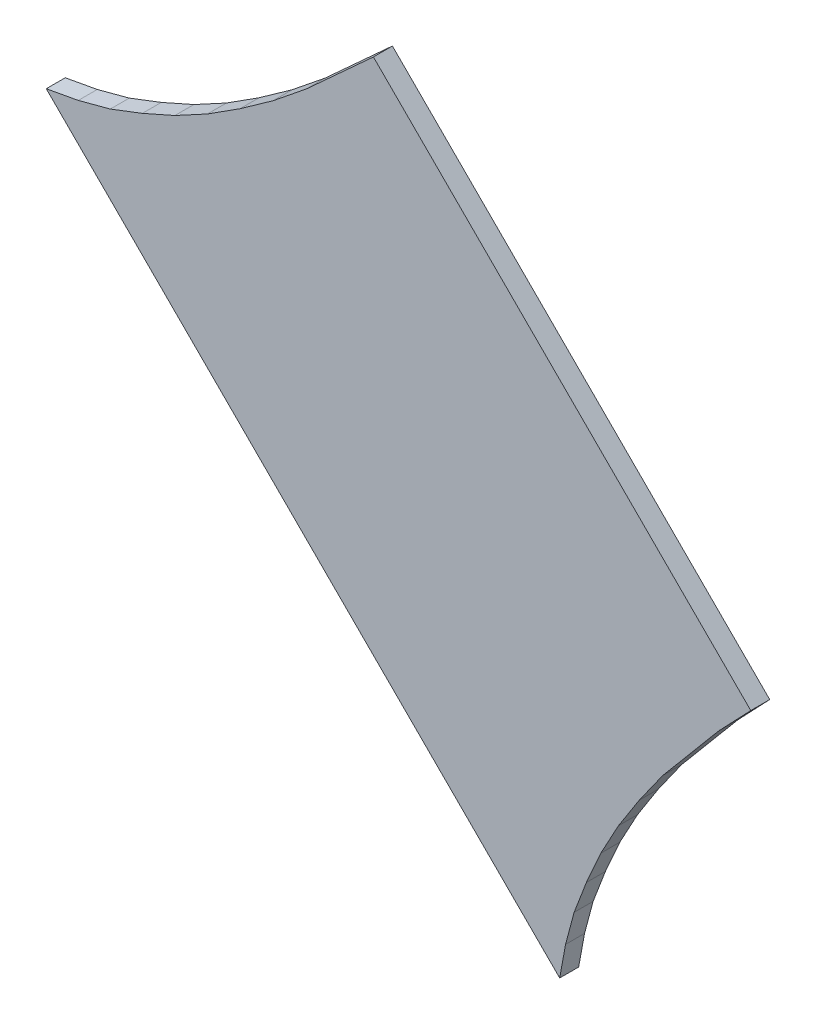
ISO-10303-21;
HEADER;
FILE_DESCRIPTION(('STEP AP214'),'2;1');
FILE_NAME('part.step','',(''),(''),'','','');
FILE_SCHEMA(('AUTOMOTIVE_DESIGN { 1 0 10303 214 1 1 1 1 }'));
ENDSEC;
DATA;
#1=APPLICATION_CONTEXT('core data for automotive mechanical design processes');
#2=APPLICATION_PROTOCOL_DEFINITION('international standard','automotive_design',2000,#1);
#3=PRODUCT_CONTEXT('',#1,'mechanical');
#4=PRODUCT('Part','Part','',(#3));
#5=PRODUCT_RELATED_PRODUCT_CATEGORY('part','',(#4));
#6=PRODUCT_DEFINITION_FORMATION('','',#4);
#7=PRODUCT_DEFINITION_CONTEXT('part definition',#1,'design');
#8=PRODUCT_DEFINITION('design','',#6,#7);
#9=PRODUCT_DEFINITION_SHAPE('','',#8);
#10=(LENGTH_UNIT() NAMED_UNIT(*) SI_UNIT(.MILLI.,.METRE.));
#11=(NAMED_UNIT(*) PLANE_ANGLE_UNIT() SI_UNIT($,.RADIAN.));
#12=(NAMED_UNIT(*) SI_UNIT($,.STERADIAN.) SOLID_ANGLE_UNIT());
#13=UNCERTAINTY_MEASURE_WITH_UNIT(LENGTH_MEASURE(1.E-05),#10,'distance_accuracy_value','');
#14=(GEOMETRIC_REPRESENTATION_CONTEXT(3) GLOBAL_UNCERTAINTY_ASSIGNED_CONTEXT((#13)) GLOBAL_UNIT_ASSIGNED_CONTEXT((#10,
#11,#12)) REPRESENTATION_CONTEXT('',''));
#15=CARTESIAN_POINT('',(0.,0.,0.));
#16=DIRECTION('',(0.,0.,1.));
#17=DIRECTION('',(1.,0.,0.));
#18=AXIS2_PLACEMENT_3D('',#15,#16,#17);
#19=CARTESIAN_POINT('',(117.693000793457,53.6599998474121,0.));
#20=DIRECTION('',(0.674137327167643,-0.738606027675963,0.));
#21=DIRECTION('',(-0.738606027675963,-0.674137327167643,0.));
#22=AXIS2_PLACEMENT_3D('',#19,#20,#21);
#23=PLANE('',#22);
#24=DIRECTION('',(-0.738606027675963,-0.674137327167643,0.));
#25=VECTOR('',#24,1.);
#26=CARTESIAN_POINT('',(117.693000793457,53.6599998474121,0.03556));
#27=LINE('',#26,#25);
#28=CARTESIAN_POINT('',(117.693000793457,53.6599998474121,0.03556));
#29=VERTEX_POINT('',#28);
#30=CARTESIAN_POINT('',(117.567001342773,53.5449981689453,0.03556));
#31=VERTEX_POINT('',#30);
#32=EDGE_CURVE('E11',#29,#31,#27,.T.);
#33=ORIENTED_EDGE('',*,*,#32,.F.);
#34=DIRECTION('',(0.,0.,1.));
#35=VECTOR('',#34,1.);
#36=CARTESIAN_POINT('',(117.693000793457,53.6599998474121,0.));
#37=LINE('',#36,#35);
#38=CARTESIAN_POINT('',(117.693000793457,53.6599998474121,0.));
#39=VERTEX_POINT('',#38);
#40=EDGE_CURVE('E24',#39,#29,#37,.T.);
#41=ORIENTED_EDGE('',*,*,#40,.F.);
#42=DIRECTION('',(-0.738606027675963,-0.674137327167643,0.));
#43=VECTOR('',#42,1.);
#44=CARTESIAN_POINT('',(117.693000793457,53.6599998474121,0.));
#45=LINE('',#44,#43);
#46=CARTESIAN_POINT('',(117.567001342773,53.5449981689453,0.));
#47=VERTEX_POINT('',#46);
#48=EDGE_CURVE('E172',#39,#47,#45,.T.);
#49=ORIENTED_EDGE('',*,*,#48,.T.);
#50=DIRECTION('',(0.,0.,1.));
#51=VECTOR('',#50,1.);
#52=CARTESIAN_POINT('',(117.567001342773,53.5449981689453,0.));
#53=LINE('',#52,#51);
#54=EDGE_CURVE('E37',#47,#31,#53,.T.);
#55=ORIENTED_EDGE('',*,*,#54,.T.);
#56=EDGE_LOOP('',(#33,#41,#49,#55));
#57=FACE_BOUND('',#56,.T.);
#58=ADVANCED_FACE('F17',(#57),#23,.F.);
#59=CARTESIAN_POINT('',(117.567001342773,53.5449981689453,0.));
#60=DIRECTION('',(0.627721559394667,-0.778437951201718,0.));
#61=DIRECTION('',(-0.778437951201718,-0.627721559394667,0.));
#62=AXIS2_PLACEMENT_3D('',#59,#60,#61);
#63=PLANE('',#62);
#64=DIRECTION('',(-0.778437951201718,-0.627721559394667,0.));
#65=VECTOR('',#64,1.);
#66=CARTESIAN_POINT('',(117.567001342773,53.5449981689453,0.03556));
#67=LINE('',#66,#65);
#68=CARTESIAN_POINT('',(117.504997253418,53.4949989318848,0.03556));
#69=VERTEX_POINT('',#68);
#70=EDGE_CURVE('E308',#31,#69,#67,.T.);
#71=ORIENTED_EDGE('',*,*,#70,.F.);
#72=ORIENTED_EDGE('',*,*,#54,.F.);
#73=DIRECTION('',(-0.778437951201718,-0.627721559394667,0.));
#74=VECTOR('',#73,1.);
#75=CARTESIAN_POINT('',(117.567001342773,53.5449981689453,0.));
#76=LINE('',#75,#74);
#77=CARTESIAN_POINT('',(117.504997253418,53.4949989318848,0.));
#78=VERTEX_POINT('',#77);
#79=EDGE_CURVE('E305',#47,#78,#76,.T.);
#80=ORIENTED_EDGE('',*,*,#79,.T.);
#81=DIRECTION('',(0.,0.,1.));
#82=VECTOR('',#81,1.);
#83=CARTESIAN_POINT('',(117.504997253418,53.4949989318848,0.));
#84=LINE('',#83,#82);
#85=EDGE_CURVE('E303',#78,#69,#84,.T.);
#86=ORIENTED_EDGE('',*,*,#85,.T.);
#87=EDGE_LOOP('',(#71,#72,#80,#86));
#88=FACE_BOUND('',#87,.T.);
#89=ADVANCED_FACE('F316',(#88),#63,.F.);
#90=CARTESIAN_POINT('',(117.504997253418,53.4949989318848,0.));
#91=DIRECTION('',(0.578757770808919,-0.815499505044786,0.));
#92=DIRECTION('',(-0.815499505044786,-0.578757770808919,0.));
#93=AXIS2_PLACEMENT_3D('',#90,#91,#92);
#94=PLANE('',#93);
#95=DIRECTION('',(-0.815499505044786,-0.578757770808919,0.));
#96=VECTOR('',#95,1.);
#97=CARTESIAN_POINT('',(117.504997253418,53.4949989318848,0.03556));
#98=LINE('',#97,#96);
#99=CARTESIAN_POINT('',(117.443000793457,53.451000213623,0.03556));
#100=VERTEX_POINT('',#99);
#101=EDGE_CURVE('E300',#69,#100,#98,.T.);
#102=ORIENTED_EDGE('',*,*,#101,.F.);
#103=ORIENTED_EDGE('',*,*,#85,.F.);
#104=DIRECTION('',(-0.815499505044786,-0.578757770808919,0.));
#105=VECTOR('',#104,1.);
#106=CARTESIAN_POINT('',(117.504997253418,53.4949989318848,0.));
#107=LINE('',#106,#105);
#108=CARTESIAN_POINT('',(117.443000793457,53.451000213623,0.));
#109=VERTEX_POINT('',#108);
#110=EDGE_CURVE('E297',#78,#109,#107,.T.);
#111=ORIENTED_EDGE('',*,*,#110,.T.);
#112=DIRECTION('',(0.,0.,1.));
#113=VECTOR('',#112,1.);
#114=CARTESIAN_POINT('',(117.443000793457,53.451000213623,0.));
#115=LINE('',#114,#113);
#116=EDGE_CURVE('E295',#109,#100,#115,.T.);
#117=ORIENTED_EDGE('',*,*,#116,.T.);
#118=EDGE_LOOP('',(#102,#103,#111,#117));
#119=FACE_BOUND('',#118,.T.);
#120=ADVANCED_FACE('F322',(#119),#94,.F.);
#121=CARTESIAN_POINT('',(117.443000793457,53.451000213623,0.));
#122=DIRECTION('',(0.538694810440099,-0.842500979942995,0.));
#123=DIRECTION('',(-0.842500979942995,-0.538694810440099,0.));
#124=AXIS2_PLACEMENT_3D('',#121,#122,#123);
#125=PLANE('',#124);
#126=DIRECTION('',(-0.842500979942995,-0.538694810440099,0.));
#127=VECTOR('',#126,1.);
#128=CARTESIAN_POINT('',(117.443000793457,53.451000213623,0.03556));
#129=LINE('',#128,#127);
#130=CARTESIAN_POINT('',(117.38200378418,53.4119987487793,0.03556));
#131=VERTEX_POINT('',#130);
#132=EDGE_CURVE('E292',#100,#131,#129,.T.);
#133=ORIENTED_EDGE('',*,*,#132,.F.);
#134=ORIENTED_EDGE('',*,*,#116,.F.);
#135=DIRECTION('',(-0.842500979942995,-0.538694810440099,0.));
#136=VECTOR('',#135,1.);
#137=CARTESIAN_POINT('',(117.443000793457,53.451000213623,0.));
#138=LINE('',#137,#136);
#139=CARTESIAN_POINT('',(117.38200378418,53.4119987487793,0.));
#140=VERTEX_POINT('',#139);
#141=EDGE_CURVE('E289',#109,#140,#138,.T.);
#142=ORIENTED_EDGE('',*,*,#141,.T.);
#143=DIRECTION('',(0.,0.,1.));
#144=VECTOR('',#143,1.);
#145=CARTESIAN_POINT('',(117.38200378418,53.4119987487793,0.));
#146=LINE('',#145,#144);
#147=EDGE_CURVE('E287',#140,#131,#146,.T.);
#148=ORIENTED_EDGE('',*,*,#147,.T.);
#149=EDGE_LOOP('',(#133,#134,#142,#148));
#150=FACE_BOUND('',#149,.T.);
#151=ADVANCED_FACE('F324',(#150),#125,.F.);
#152=CARTESIAN_POINT('',(117.38200378418,53.4119987487793,0.));
#153=DIRECTION('',(0.475758597963286,-0.879575895795245,0.));
#154=DIRECTION('',(-0.879575895795245,-0.475758597963286,0.));
#155=AXIS2_PLACEMENT_3D('',#152,#153,#154);
#156=PLANE('',#155);
#157=DIRECTION('',(-0.879575895795245,-0.475758597963286,0.));
#158=VECTOR('',#157,1.);
#159=CARTESIAN_POINT('',(117.38200378418,53.4119987487793,0.03556));
#160=LINE('',#159,#158);
#161=CARTESIAN_POINT('',(117.320999145508,53.3790016174316,0.03556));
#162=VERTEX_POINT('',#161);
#163=EDGE_CURVE('E284',#131,#162,#160,.T.);
#164=ORIENTED_EDGE('',*,*,#163,.F.);
#165=ORIENTED_EDGE('',*,*,#147,.F.);
#166=DIRECTION('',(-0.879575895795245,-0.475758597963286,0.));
#167=VECTOR('',#166,1.);
#168=CARTESIAN_POINT('',(117.38200378418,53.4119987487793,0.));
#169=LINE('',#168,#167);
#170=CARTESIAN_POINT('',(117.320999145508,53.3790016174316,0.));
#171=VERTEX_POINT('',#170);
#172=EDGE_CURVE('E281',#140,#171,#169,.T.);
#173=ORIENTED_EDGE('',*,*,#172,.T.);
#174=DIRECTION('',(0.,0.,1.));
#175=VECTOR('',#174,1.);
#176=CARTESIAN_POINT('',(117.320999145508,53.3790016174316,0.));
#177=LINE('',#176,#175);
#178=EDGE_CURVE('E279',#171,#162,#177,.T.);
#179=ORIENTED_EDGE('',*,*,#178,.T.);
#180=EDGE_LOOP('',(#164,#165,#173,#179));
#181=FACE_BOUND('',#180,.T.);
#182=ADVANCED_FACE('F329',(#181),#156,.F.);
#183=CARTESIAN_POINT('',(117.320999145508,53.3790016174316,0.));
#184=DIRECTION('',(0.404769061439909,-0.914418944959615,0.));
#185=DIRECTION('',(-0.914418944959615,-0.404769061439909,0.));
#186=AXIS2_PLACEMENT_3D('',#183,#184,#185);
#187=PLANE('',#186);
#188=DIRECTION('',(-0.914418944959615,-0.404769061439909,0.));
#189=VECTOR('',#188,1.);
#190=CARTESIAN_POINT('',(117.320999145508,53.3790016174316,0.03556));
#191=LINE('',#190,#189);
#192=CARTESIAN_POINT('',(117.26000213623,53.3520011901855,0.03556));
#193=VERTEX_POINT('',#192);
#194=EDGE_CURVE('E276',#162,#193,#191,.T.);
#195=ORIENTED_EDGE('',*,*,#194,.F.);
#196=ORIENTED_EDGE('',*,*,#178,.F.);
#197=DIRECTION('',(-0.914418944959615,-0.404769061439909,0.));
#198=VECTOR('',#197,1.);
#199=CARTESIAN_POINT('',(117.320999145508,53.3790016174316,0.));
#200=LINE('',#199,#198);
#201=CARTESIAN_POINT('',(117.26000213623,53.3520011901855,0.));
#202=VERTEX_POINT('',#201);
#203=EDGE_CURVE('E273',#171,#202,#200,.T.);
#204=ORIENTED_EDGE('',*,*,#203,.T.);
#205=DIRECTION('',(0.,0.,1.));
#206=VECTOR('',#205,1.);
#207=CARTESIAN_POINT('',(117.26000213623,53.3520011901855,0.));
#208=LINE('',#207,#206);
#209=EDGE_CURVE('E271',#202,#193,#208,.T.);
#210=ORIENTED_EDGE('',*,*,#209,.T.);
#211=EDGE_LOOP('',(#195,#196,#204,#210));
#212=FACE_BOUND('',#211,.T.);
#213=ADVANCED_FACE('F332',(#212),#187,.F.);
#214=CARTESIAN_POINT('',(117.26000213623,53.3520011901855,0.));
#215=DIRECTION('',(0.357944637527047,-0.933742810663424,0.));
#216=DIRECTION('',(-0.933742810663424,-0.357944637527047,0.));
#217=AXIS2_PLACEMENT_3D('',#214,#215,#216);
#218=PLANE('',#217);
#219=DIRECTION('',(-0.933742810663424,-0.357944637527047,0.));
#220=VECTOR('',#219,1.);
#221=CARTESIAN_POINT('',(117.26000213623,53.3520011901855,0.03556));
#222=LINE('',#221,#220);
#223=CARTESIAN_POINT('',(117.199996948242,53.3289985656738,0.03556));
#224=VERTEX_POINT('',#223);
#225=EDGE_CURVE('E268',#193,#224,#222,.T.);
#226=ORIENTED_EDGE('',*,*,#225,.F.);
#227=ORIENTED_EDGE('',*,*,#209,.F.);
#228=DIRECTION('',(-0.933742810663424,-0.357944637527047,0.));
#229=VECTOR('',#228,1.);
#230=CARTESIAN_POINT('',(117.26000213623,53.3520011901855,0.));
#231=LINE('',#230,#229);
#232=CARTESIAN_POINT('',(117.199996948242,53.3289985656738,0.));
#233=VERTEX_POINT('',#232);
#234=EDGE_CURVE('E265',#202,#233,#231,.T.);
#235=ORIENTED_EDGE('',*,*,#234,.T.);
#236=DIRECTION('',(0.,0.,1.));
#237=VECTOR('',#236,1.);
#238=CARTESIAN_POINT('',(117.199996948242,53.3289985656738,0.));
#239=LINE('',#238,#237);
#240=EDGE_CURVE('E263',#233,#224,#239,.T.);
#241=ORIENTED_EDGE('',*,*,#240,.T.);
#242=EDGE_LOOP('',(#226,#227,#235,#241));
#243=FACE_BOUND('',#242,.T.);
#244=ADVANCED_FACE('F337',(#243),#218,.F.);
#245=CARTESIAN_POINT('',(117.199996948242,53.3289985656738,0.));
#246=DIRECTION('',(0.257655003142413,-0.966236978880276,0.));
#247=DIRECTION('',(-0.966236978880276,-0.257655003142413,0.));
#248=AXIS2_PLACEMENT_3D('',#245,#246,#247);
#249=PLANE('',#248);
#250=DIRECTION('',(-0.966236978880276,-0.257655003142413,0.));
#251=VECTOR('',#250,1.);
#252=CARTESIAN_POINT('',(117.199996948242,53.3289985656738,0.03556));
#253=LINE('',#252,#251);
#254=CARTESIAN_POINT('',(117.139999389648,53.3129997253418,0.03556));
#255=VERTEX_POINT('',#254);
#256=EDGE_CURVE('E260',#224,#255,#253,.T.);
#257=ORIENTED_EDGE('',*,*,#256,.F.);
#258=ORIENTED_EDGE('',*,*,#240,.F.);
#259=DIRECTION('',(-0.966236978880276,-0.257655003142413,0.));
#260=VECTOR('',#259,1.);
#261=CARTESIAN_POINT('',(117.199996948242,53.3289985656738,0.));
#262=LINE('',#261,#260);
#263=CARTESIAN_POINT('',(117.139999389648,53.3129997253418,0.));
#264=VERTEX_POINT('',#263);
#265=EDGE_CURVE('E257',#233,#264,#262,.T.);
#266=ORIENTED_EDGE('',*,*,#265,.T.);
#267=DIRECTION('',(0.,0.,1.));
#268=VECTOR('',#267,1.);
#269=CARTESIAN_POINT('',(117.139999389648,53.3129997253418,0.));
#270=LINE('',#269,#268);
#271=EDGE_CURVE('E255',#264,#255,#270,.T.);
#272=ORIENTED_EDGE('',*,*,#271,.T.);
#273=EDGE_LOOP('',(#257,#258,#266,#272));
#274=FACE_BOUND('',#273,.T.);
#275=ADVANCED_FACE('F340',(#274),#249,.F.);
#276=CARTESIAN_POINT('',(117.139999389648,53.3129997253418,0.));
#277=DIRECTION('',(0.180360137856034,-0.983600640845944,0.));
#278=DIRECTION('',(-0.983600640845944,-0.180360137856034,0.));
#279=AXIS2_PLACEMENT_3D('',#276,#277,#278);
#280=PLANE('',#279);
#281=DIRECTION('',(-0.983600640845944,-0.180360137856034,0.));
#282=VECTOR('',#281,1.);
#283=CARTESIAN_POINT('',(117.139999389648,53.3129997253418,0.03556));
#284=LINE('',#283,#282);
#285=CARTESIAN_POINT('',(117.080001831055,53.3019981384277,0.03556));
#286=VERTEX_POINT('',#285);
#287=EDGE_CURVE('E252',#255,#286,#284,.T.);
#288=ORIENTED_EDGE('',*,*,#287,.F.);
#289=ORIENTED_EDGE('',*,*,#271,.F.);
#290=DIRECTION('',(-0.983600640845944,-0.180360137856034,0.));
#291=VECTOR('',#290,1.);
#292=CARTESIAN_POINT('',(117.139999389648,53.3129997253418,0.));
#293=LINE('',#292,#291);
#294=CARTESIAN_POINT('',(117.080001831055,53.3019981384277,0.));
#295=VERTEX_POINT('',#294);
#296=EDGE_CURVE('E249',#264,#295,#293,.T.);
#297=ORIENTED_EDGE('',*,*,#296,.T.);
#298=DIRECTION('',(0.,0.,1.));
#299=VECTOR('',#298,1.);
#300=CARTESIAN_POINT('',(117.080001831055,53.3019981384277,0.));
#301=LINE('',#300,#299);
#302=EDGE_CURVE('E247',#295,#286,#301,.T.);
#303=ORIENTED_EDGE('',*,*,#302,.T.);
#304=EDGE_LOOP('',(#288,#289,#297,#303));
#305=FACE_BOUND('',#304,.T.);
#306=ADVANCED_FACE('F345',(#305),#280,.F.);
#307=CARTESIAN_POINT('',(117.080001831055,53.3019981384277,0.));
#308=DIRECTION('',(0.707106781186548,0.707106781186548,0.));
#309=DIRECTION('',(0.707106781186548,-0.707106781186548,0.));
#310=AXIS2_PLACEMENT_3D('',#307,#308,#309);
#311=PLANE('',#310);
#312=DIRECTION('',(0.707106781186548,-0.707106781186548,0.));
#313=VECTOR('',#312,1.);
#314=CARTESIAN_POINT('',(117.080001831055,53.3019981384277,0.03556));
#315=LINE('',#314,#313);
#316=CARTESIAN_POINT('',(118.041999816895,52.3400001525879,0.03556));
#317=VERTEX_POINT('',#316);
#318=EDGE_CURVE('E244',#286,#317,#315,.T.);
#319=ORIENTED_EDGE('',*,*,#318,.F.);
#320=ORIENTED_EDGE('',*,*,#302,.F.);
#321=DIRECTION('',(0.707106781186548,-0.707106781186548,0.));
#322=VECTOR('',#321,1.);
#323=CARTESIAN_POINT('',(117.080001831055,53.3019981384277,0.));
#324=LINE('',#323,#322);
#325=CARTESIAN_POINT('',(118.041999816895,52.3400001525879,0.));
#326=VERTEX_POINT('',#325);
#327=EDGE_CURVE('E241',#295,#326,#324,.T.);
#328=ORIENTED_EDGE('',*,*,#327,.T.);
#329=DIRECTION('',(0.,0.,1.));
#330=VECTOR('',#329,1.);
#331=CARTESIAN_POINT('',(118.041999816895,52.3400001525879,0.));
#332=LINE('',#331,#330);
#333=EDGE_CURVE('E239',#326,#317,#332,.T.);
#334=ORIENTED_EDGE('',*,*,#333,.T.);
#335=EDGE_LOOP('',(#319,#320,#328,#334));
#336=FACE_BOUND('',#335,.T.);
#337=ADVANCED_FACE('F348',(#336),#311,.F.);
#338=CARTESIAN_POINT('',(118.041999816895,52.3400001525879,0.));
#339=DIRECTION('',(-0.983602675011749,0.180349044105403,0.));
#340=DIRECTION('',(0.180349044105403,0.983602675011749,0.));
#341=AXIS2_PLACEMENT_3D('',#338,#339,#340);
#342=PLANE('',#341);
#343=DIRECTION('',(0.180349044105403,0.983602675011749,0.));
#344=VECTOR('',#343,1.);
#345=CARTESIAN_POINT('',(118.041999816895,52.3400001525879,0.03556));
#346=LINE('',#345,#344);
#347=CARTESIAN_POINT('',(118.053001403809,52.4000015258789,0.03556));
#348=VERTEX_POINT('',#347);
#349=EDGE_CURVE('E236',#317,#348,#346,.T.);
#350=ORIENTED_EDGE('',*,*,#349,.F.);
#351=ORIENTED_EDGE('',*,*,#333,.F.);
#352=DIRECTION('',(0.180349044105403,0.983602675011749,0.));
#353=VECTOR('',#352,1.);
#354=CARTESIAN_POINT('',(118.041999816895,52.3400001525879,0.));
#355=LINE('',#354,#353);
#356=CARTESIAN_POINT('',(118.053001403809,52.4000015258789,0.));
#357=VERTEX_POINT('',#356);
#358=EDGE_CURVE('E233',#326,#357,#355,.T.);
#359=ORIENTED_EDGE('',*,*,#358,.T.);
#360=DIRECTION('',(0.,0.,1.));
#361=VECTOR('',#360,1.);
#362=CARTESIAN_POINT('',(118.053001403809,52.4000015258789,0.));
#363=LINE('',#362,#361);
#364=EDGE_CURVE('E231',#357,#348,#363,.T.);
#365=ORIENTED_EDGE('',*,*,#364,.T.);
#366=EDGE_LOOP('',(#350,#351,#359,#365));
#367=FACE_BOUND('',#366,.T.);
#368=ADVANCED_FACE('F353',(#367),#342,.F.);
#369=CARTESIAN_POINT('',(118.053001403809,52.4000015258789,0.));
#370=DIRECTION('',(-0.966236978880276,0.257655003142413,0.));
#371=DIRECTION('',(0.257655003142413,0.966236978880276,0.));
#372=AXIS2_PLACEMENT_3D('',#369,#370,#371);
#373=PLANE('',#372);
#374=DIRECTION('',(0.257655003142413,0.966236978880276,0.));
#375=VECTOR('',#374,1.);
#376=CARTESIAN_POINT('',(118.053001403809,52.4000015258789,0.03556));
#377=LINE('',#376,#375);
#378=CARTESIAN_POINT('',(118.069000244141,52.4599990844727,0.03556));
#379=VERTEX_POINT('',#378);
#380=EDGE_CURVE('E228',#348,#379,#377,.T.);
#381=ORIENTED_EDGE('',*,*,#380,.F.);
#382=ORIENTED_EDGE('',*,*,#364,.F.);
#383=DIRECTION('',(0.257655003142413,0.966236978880276,0.));
#384=VECTOR('',#383,1.);
#385=CARTESIAN_POINT('',(118.053001403809,52.4000015258789,0.));
#386=LINE('',#385,#384);
#387=CARTESIAN_POINT('',(118.069000244141,52.4599990844727,0.));
#388=VERTEX_POINT('',#387);
#389=EDGE_CURVE('E225',#357,#388,#386,.T.);
#390=ORIENTED_EDGE('',*,*,#389,.T.);
#391=DIRECTION('',(0.,0.,1.));
#392=VECTOR('',#391,1.);
#393=CARTESIAN_POINT('',(118.069000244141,52.4599990844727,0.));
#394=LINE('',#393,#392);
#395=EDGE_CURVE('E223',#388,#379,#394,.T.);
#396=ORIENTED_EDGE('',*,*,#395,.T.);
#397=EDGE_LOOP('',(#381,#382,#390,#396));
#398=FACE_BOUND('',#397,.T.);
#399=ADVANCED_FACE('F356',(#398),#373,.F.);
#400=CARTESIAN_POINT('',(118.069000244141,52.4599990844727,0.));
#401=DIRECTION('',(-0.933735204487285,0.357964478546527,0.));
#402=DIRECTION('',(0.357964478546527,0.933735204487285,0.));
#403=AXIS2_PLACEMENT_3D('',#400,#401,#402);
#404=PLANE('',#403);
#405=DIRECTION('',(0.357964478546527,0.933735204487285,0.));
#406=VECTOR('',#405,1.);
#407=CARTESIAN_POINT('',(118.069000244141,52.4599990844727,0.03556));
#408=LINE('',#407,#406);
#409=CARTESIAN_POINT('',(118.092002868652,52.5200004577637,0.03556));
#410=VERTEX_POINT('',#409);
#411=EDGE_CURVE('E220',#379,#410,#408,.T.);
#412=ORIENTED_EDGE('',*,*,#411,.F.);
#413=ORIENTED_EDGE('',*,*,#395,.F.);
#414=DIRECTION('',(0.357964478546527,0.933735204487285,0.));
#415=VECTOR('',#414,1.);
#416=CARTESIAN_POINT('',(118.069000244141,52.4599990844727,0.));
#417=LINE('',#416,#415);
#418=CARTESIAN_POINT('',(118.092002868652,52.5200004577637,0.));
#419=VERTEX_POINT('',#418);
#420=EDGE_CURVE('E217',#388,#419,#417,.T.);
#421=ORIENTED_EDGE('',*,*,#420,.T.);
#422=DIRECTION('',(0.,0.,1.));
#423=VECTOR('',#422,1.);
#424=CARTESIAN_POINT('',(118.092002868652,52.5200004577637,0.));
#425=LINE('',#424,#423);
#426=EDGE_CURVE('E215',#419,#410,#425,.T.);
#427=ORIENTED_EDGE('',*,*,#426,.T.);
#428=EDGE_LOOP('',(#412,#413,#421,#427));
#429=FACE_BOUND('',#428,.T.);
#430=ADVANCED_FACE('F361',(#429),#404,.F.);
#431=CARTESIAN_POINT('',(118.092002868652,52.5200004577637,0.));
#432=DIRECTION('',(-0.914428313615905,0.404747895927295,0.));
#433=DIRECTION('',(0.404747895927295,0.914428313615905,0.));
#434=AXIS2_PLACEMENT_3D('',#431,#432,#433);
#435=PLANE('',#434);
#436=DIRECTION('',(0.404747895927295,0.914428313615905,0.));
#437=VECTOR('',#436,1.);
#438=CARTESIAN_POINT('',(118.092002868652,52.5200004577637,0.03556));
#439=LINE('',#438,#437);
#440=CARTESIAN_POINT('',(118.119003295898,52.5810012817383,0.03556));
#441=VERTEX_POINT('',#440);
#442=EDGE_CURVE('E212',#410,#441,#439,.T.);
#443=ORIENTED_EDGE('',*,*,#442,.F.);
#444=ORIENTED_EDGE('',*,*,#426,.F.);
#445=DIRECTION('',(0.404747895927295,0.914428313615905,0.));
#446=VECTOR('',#445,1.);
#447=CARTESIAN_POINT('',(118.092002868652,52.5200004577637,0.));
#448=LINE('',#447,#446);
#449=CARTESIAN_POINT('',(118.119003295898,52.5810012817383,0.));
#450=VERTEX_POINT('',#449);
#451=EDGE_CURVE('E209',#419,#450,#448,.T.);
#452=ORIENTED_EDGE('',*,*,#451,.T.);
#453=DIRECTION('',(0.,0.,1.));
#454=VECTOR('',#453,1.);
#455=CARTESIAN_POINT('',(118.119003295898,52.5810012817383,0.));
#456=LINE('',#455,#454);
#457=EDGE_CURVE('E207',#450,#441,#456,.T.);
#458=ORIENTED_EDGE('',*,*,#457,.T.);
#459=EDGE_LOOP('',(#443,#444,#452,#458));
#460=FACE_BOUND('',#459,.T.);
#461=ADVANCED_FACE('F364',(#460),#435,.F.);
#462=CARTESIAN_POINT('',(118.119003295898,52.5810012817383,0.));
#463=DIRECTION('',(-0.879550993644464,0.475804633835186,0.));
#464=DIRECTION('',(0.475804633835186,0.879550993644464,0.));
#465=AXIS2_PLACEMENT_3D('',#462,#463,#464);
#466=PLANE('',#465);
#467=DIRECTION('',(0.475804633835186,0.879550993644464,0.));
#468=VECTOR('',#467,1.);
#469=CARTESIAN_POINT('',(118.119003295898,52.5810012817383,0.03556));
#470=LINE('',#469,#468);
#471=CARTESIAN_POINT('',(118.152000427246,52.6419982910156,0.03556));
#472=VERTEX_POINT('',#471);
#473=EDGE_CURVE('E204',#441,#472,#470,.T.);
#474=ORIENTED_EDGE('',*,*,#473,.F.);
#475=ORIENTED_EDGE('',*,*,#457,.F.);
#476=DIRECTION('',(0.475804633835186,0.879550993644464,0.));
#477=VECTOR('',#476,1.);
#478=CARTESIAN_POINT('',(118.119003295898,52.5810012817383,0.));
#479=LINE('',#478,#477);
#480=CARTESIAN_POINT('',(118.152000427246,52.6419982910156,0.));
#481=VERTEX_POINT('',#480);
#482=EDGE_CURVE('E201',#450,#481,#479,.T.);
#483=ORIENTED_EDGE('',*,*,#482,.T.);
#484=DIRECTION('',(0.,0.,1.));
#485=VECTOR('',#484,1.);
#486=CARTESIAN_POINT('',(118.152000427246,52.6419982910156,0.));
#487=LINE('',#486,#485);
#488=EDGE_CURVE('E199',#481,#472,#487,.T.);
#489=ORIENTED_EDGE('',*,*,#488,.T.);
#490=EDGE_LOOP('',(#474,#475,#483,#489));
#491=FACE_BOUND('',#490,.T.);
#492=ADVANCED_FACE('F369',(#491),#466,.F.);
#493=CARTESIAN_POINT('',(118.152000427246,52.6419982910156,0.));
#494=DIRECTION('',(-0.842516268926674,0.538670898224396,0.));
#495=DIRECTION('',(0.538670898224396,0.842516268926674,0.));
#496=AXIS2_PLACEMENT_3D('',#493,#494,#495);
#497=PLANE('',#496);
#498=DIRECTION('',(0.538670898224396,0.842516268926674,0.));
#499=VECTOR('',#498,1.);
#500=CARTESIAN_POINT('',(118.152000427246,52.6419982910156,0.03556));
#501=LINE('',#500,#499);
#502=CARTESIAN_POINT('',(118.19100189209,52.7029991149902,0.03556));
#503=VERTEX_POINT('',#502);
#504=EDGE_CURVE('E196',#472,#503,#501,.T.);
#505=ORIENTED_EDGE('',*,*,#504,.F.);
#506=ORIENTED_EDGE('',*,*,#488,.F.);
#507=DIRECTION('',(0.538670898224396,0.842516268926674,0.));
#508=VECTOR('',#507,1.);
#509=CARTESIAN_POINT('',(118.152000427246,52.6419982910156,0.));
#510=LINE('',#509,#508);
#511=CARTESIAN_POINT('',(118.19100189209,52.7029991149902,0.));
#512=VERTEX_POINT('',#511);
#513=EDGE_CURVE('E193',#481,#512,#510,.T.);
#514=ORIENTED_EDGE('',*,*,#513,.T.);
#515=DIRECTION('',(0.,0.,1.));
#516=VECTOR('',#515,1.);
#517=CARTESIAN_POINT('',(118.19100189209,52.7029991149902,0.));
#518=LINE('',#517,#516);
#519=EDGE_CURVE('E191',#512,#503,#518,.T.);
#520=ORIENTED_EDGE('',*,*,#519,.T.);
#521=EDGE_LOOP('',(#505,#506,#514,#520));
#522=FACE_BOUND('',#521,.T.);
#523=ADVANCED_FACE('F372',(#522),#497,.F.);
#524=CARTESIAN_POINT('',(118.19100189209,52.7029991149902,0.));
#525=DIRECTION('',(-0.815516311801043,0.578734088495246,0.));
#526=DIRECTION('',(0.578734088495246,0.815516311801043,0.));
#527=AXIS2_PLACEMENT_3D('',#524,#525,#526);
#528=PLANE('',#527);
#529=DIRECTION('',(0.578734088495246,0.815516311801043,0.));
#530=VECTOR('',#529,1.);
#531=CARTESIAN_POINT('',(118.19100189209,52.7029991149902,0.03556));
#532=LINE('',#531,#530);
#533=CARTESIAN_POINT('',(118.235000610352,52.7649993896484,0.03556));
#534=VERTEX_POINT('',#533);
#535=EDGE_CURVE('E188',#503,#534,#532,.T.);
#536=ORIENTED_EDGE('',*,*,#535,.F.);
#537=ORIENTED_EDGE('',*,*,#519,.F.);
#538=DIRECTION('',(0.578734088495246,0.815516311801043,0.));
#539=VECTOR('',#538,1.);
#540=CARTESIAN_POINT('',(118.19100189209,52.7029991149902,0.));
#541=LINE('',#540,#539);
#542=CARTESIAN_POINT('',(118.235000610352,52.7649993896484,0.));
#543=VERTEX_POINT('',#542);
#544=EDGE_CURVE('E185',#512,#543,#541,.T.);
#545=ORIENTED_EDGE('',*,*,#544,.T.);
#546=DIRECTION('',(0.,0.,1.));
#547=VECTOR('',#546,1.);
#548=CARTESIAN_POINT('',(118.235000610352,52.7649993896484,0.));
#549=LINE('',#548,#547);
#550=EDGE_CURVE('E183',#543,#534,#549,.T.);
#551=ORIENTED_EDGE('',*,*,#550,.T.);
#552=EDGE_LOOP('',(#536,#537,#545,#551));
#553=FACE_BOUND('',#552,.T.);
#554=ADVANCED_FACE('F377',(#553),#528,.F.);
#555=CARTESIAN_POINT('',(118.235000610352,52.7649993896484,0.));
#556=DIRECTION('',(-0.765717754219923,0.643176741551183,0.));
#557=DIRECTION('',(0.643176741551183,0.765717754219923,0.));
#558=AXIS2_PLACEMENT_3D('',#555,#556,#557);
#559=PLANE('',#558);
#560=DIRECTION('',(0.643176741551183,0.765717754219923,0.));
#561=VECTOR('',#560,1.);
#562=CARTESIAN_POINT('',(118.235000610352,52.7649993896484,0.03556));
#563=LINE('',#562,#561);
#564=CARTESIAN_POINT('',(118.339996337891,52.8899993896484,0.03556));
#565=VERTEX_POINT('',#564);
#566=EDGE_CURVE('E180',#534,#565,#563,.T.);
#567=ORIENTED_EDGE('',*,*,#566,.F.);
#568=ORIENTED_EDGE('',*,*,#550,.F.);
#569=DIRECTION('',(0.643176741551183,0.765717754219923,0.));
#570=VECTOR('',#569,1.);
#571=CARTESIAN_POINT('',(118.235000610352,52.7649993896484,0.));
#572=LINE('',#571,#570);
#573=CARTESIAN_POINT('',(118.339996337891,52.8899993896484,0.));
#574=VERTEX_POINT('',#573);
#575=EDGE_CURVE('E178',#543,#574,#572,.T.);
#576=ORIENTED_EDGE('',*,*,#575,.T.);
#577=DIRECTION('',(0.,0.,1.));
#578=VECTOR('',#577,1.);
#579=CARTESIAN_POINT('',(118.339996337891,52.8899993896484,0.));
#580=LINE('',#579,#578);
#581=EDGE_CURVE('E163',#574,#565,#580,.T.);
#582=ORIENTED_EDGE('',*,*,#581,.T.);
#583=EDGE_LOOP('',(#567,#568,#576,#582));
#584=FACE_BOUND('',#583,.T.);
#585=ADVANCED_FACE('F379',(#584),#559,.F.);
#586=CARTESIAN_POINT('',(118.339996337891,52.8899993896484,0.));
#587=DIRECTION('',(-0.724106649391603,0.689688016647285,0.));
#588=DIRECTION('',(0.689688016647285,0.724106649391603,0.));
#589=AXIS2_PLACEMENT_3D('',#586,#587,#588);
#590=PLANE('',#589);
#591=DIRECTION('',(0.689688016647285,0.724106649391603,0.));
#592=VECTOR('',#591,1.);
#593=CARTESIAN_POINT('',(118.339996337891,52.8899993896484,0.03556));
#594=LINE('',#593,#592);
#595=CARTESIAN_POINT('',(118.400001525879,52.9529991149902,0.03556));
#596=VERTEX_POINT('',#595);
#597=EDGE_CURVE('E167',#565,#596,#594,.T.);
#598=ORIENTED_EDGE('',*,*,#597,.F.);
#599=ORIENTED_EDGE('',*,*,#581,.F.);
#600=DIRECTION('',(0.689688016647285,0.724106649391603,0.));
#601=VECTOR('',#600,1.);
#602=CARTESIAN_POINT('',(118.339996337891,52.8899993896484,0.));
#603=LINE('',#602,#601);
#604=CARTESIAN_POINT('',(118.400001525879,52.9529991149902,0.));
#605=VERTEX_POINT('',#604);
#606=EDGE_CURVE('E159',#574,#605,#603,.T.);
#607=ORIENTED_EDGE('',*,*,#606,.T.);
#608=DIRECTION('',(0.,0.,1.));
#609=VECTOR('',#608,1.);
#610=CARTESIAN_POINT('',(118.400001525879,52.9529991149902,0.));
#611=LINE('',#610,#609);
#612=EDGE_CURVE('E149',#605,#596,#611,.T.);
#613=ORIENTED_EDGE('',*,*,#612,.T.);
#614=EDGE_LOOP('',(#598,#599,#607,#613));
#615=FACE_BOUND('',#614,.T.);
#616=ADVANCED_FACE('F162',(#615),#590,.F.);
#617=CARTESIAN_POINT('',(118.400001525879,52.9529991149902,0.));
#618=DIRECTION('',(-0.707106781186548,-0.707106781186548,0.));
#619=DIRECTION('',(-0.707106781186548,0.707106781186548,0.));
#620=AXIS2_PLACEMENT_3D('',#617,#618,#619);
#621=PLANE('',#620);
#622=DIRECTION('',(-0.707106781186548,0.707106781186548,0.));
#623=VECTOR('',#622,1.);
#624=CARTESIAN_POINT('',(118.400001525879,52.9529991149902,0.03556));
#625=LINE('',#624,#623);
#626=EDGE_CURVE('E155',#596,#29,#625,.T.);
#627=ORIENTED_EDGE('',*,*,#626,.F.);
#628=ORIENTED_EDGE('',*,*,#612,.F.);
#629=DIRECTION('',(-0.707106781186548,0.707106781186548,0.));
#630=VECTOR('',#629,1.);
#631=CARTESIAN_POINT('',(118.400001525879,52.9529991149902,0.));
#632=LINE('',#631,#630);
#633=EDGE_CURVE('E153',#605,#39,#632,.T.);
#634=ORIENTED_EDGE('',*,*,#633,.T.);
#635=ORIENTED_EDGE('',*,*,#40,.T.);
#636=EDGE_LOOP('',(#627,#628,#634,#635));
#637=FACE_BOUND('',#636,.T.);
#638=ADVANCED_FACE('F151',(#637),#621,.F.);
#639=CARTESIAN_POINT('',(117.693000793457,53.6599998474121,0.));
#640=DIRECTION('',(0.,0.,1.));
#641=DIRECTION('',(1.,0.,0.));
#642=AXIS2_PLACEMENT_3D('',#639,#640,#641);
#643=PLANE('',#642);
#644=ORIENTED_EDGE('',*,*,#633,.F.);
#645=ORIENTED_EDGE('',*,*,#606,.F.);
#646=ORIENTED_EDGE('',*,*,#575,.F.);
#647=ORIENTED_EDGE('',*,*,#544,.F.);
#648=ORIENTED_EDGE('',*,*,#513,.F.);
#649=ORIENTED_EDGE('',*,*,#482,.F.);
#650=ORIENTED_EDGE('',*,*,#451,.F.);
#651=ORIENTED_EDGE('',*,*,#420,.F.);
#652=ORIENTED_EDGE('',*,*,#389,.F.);
#653=ORIENTED_EDGE('',*,*,#358,.F.);
#654=ORIENTED_EDGE('',*,*,#327,.F.);
#655=ORIENTED_EDGE('',*,*,#296,.F.);
#656=ORIENTED_EDGE('',*,*,#265,.F.);
#657=ORIENTED_EDGE('',*,*,#234,.F.);
#658=ORIENTED_EDGE('',*,*,#203,.F.);
#659=ORIENTED_EDGE('',*,*,#172,.F.);
#660=ORIENTED_EDGE('',*,*,#141,.F.);
#661=ORIENTED_EDGE('',*,*,#110,.F.);
#662=ORIENTED_EDGE('',*,*,#79,.F.);
#663=ORIENTED_EDGE('',*,*,#48,.F.);
#664=EDGE_LOOP('',(#644,#645,#646,#647,#648,#649,#650,#651,#652,#653,#654,#655,#656,#657,#658,
#659,#660,#661,#662,#663));
#665=FACE_BOUND('',#664,.T.);
#666=ADVANCED_FACE('F170',(#665),#643,.F.);
#667=CARTESIAN_POINT('',(117.693000793457,53.6599998474121,0.03556));
#668=DIRECTION('',(0.,0.,1.));
#669=DIRECTION('',(1.,0.,0.));
#670=AXIS2_PLACEMENT_3D('',#667,#668,#669);
#671=PLANE('',#670);
#672=ORIENTED_EDGE('',*,*,#32,.T.);
#673=ORIENTED_EDGE('',*,*,#70,.T.);
#674=ORIENTED_EDGE('',*,*,#101,.T.);
#675=ORIENTED_EDGE('',*,*,#132,.T.);
#676=ORIENTED_EDGE('',*,*,#163,.T.);
#677=ORIENTED_EDGE('',*,*,#194,.T.);
#678=ORIENTED_EDGE('',*,*,#225,.T.);
#679=ORIENTED_EDGE('',*,*,#256,.T.);
#680=ORIENTED_EDGE('',*,*,#287,.T.);
#681=ORIENTED_EDGE('',*,*,#318,.T.);
#682=ORIENTED_EDGE('',*,*,#349,.T.);
#683=ORIENTED_EDGE('',*,*,#380,.T.);
#684=ORIENTED_EDGE('',*,*,#411,.T.);
#685=ORIENTED_EDGE('',*,*,#442,.T.);
#686=ORIENTED_EDGE('',*,*,#473,.T.);
#687=ORIENTED_EDGE('',*,*,#504,.T.);
#688=ORIENTED_EDGE('',*,*,#535,.T.);
#689=ORIENTED_EDGE('',*,*,#566,.T.);
#690=ORIENTED_EDGE('',*,*,#597,.T.);
#691=ORIENTED_EDGE('',*,*,#626,.T.);
#692=EDGE_LOOP('',(#672,#673,#674,#675,#676,#677,#678,#679,#680,#681,#682,#683,#684,#685,#686,
#687,#688,#689,#690,#691));
#693=FACE_BOUND('',#692,.T.);
#694=ADVANCED_FACE('F319',(#693),#671,.T.);
#695=CLOSED_SHELL('',(#58,#89,#120,#151,#182,#213,#244,#275,#306,#337,#368,#399,#430,#461,#492,
#523,#554,#585,#616,#638,#666,#694));
#696=MANIFOLD_SOLID_BREP('B1',#695);
#697=ADVANCED_BREP_SHAPE_REPRESENTATION('',(#18,#696),#14);
#698=SHAPE_DEFINITION_REPRESENTATION(#9,#697);
ENDSEC;
END-ISO-10303-21;
